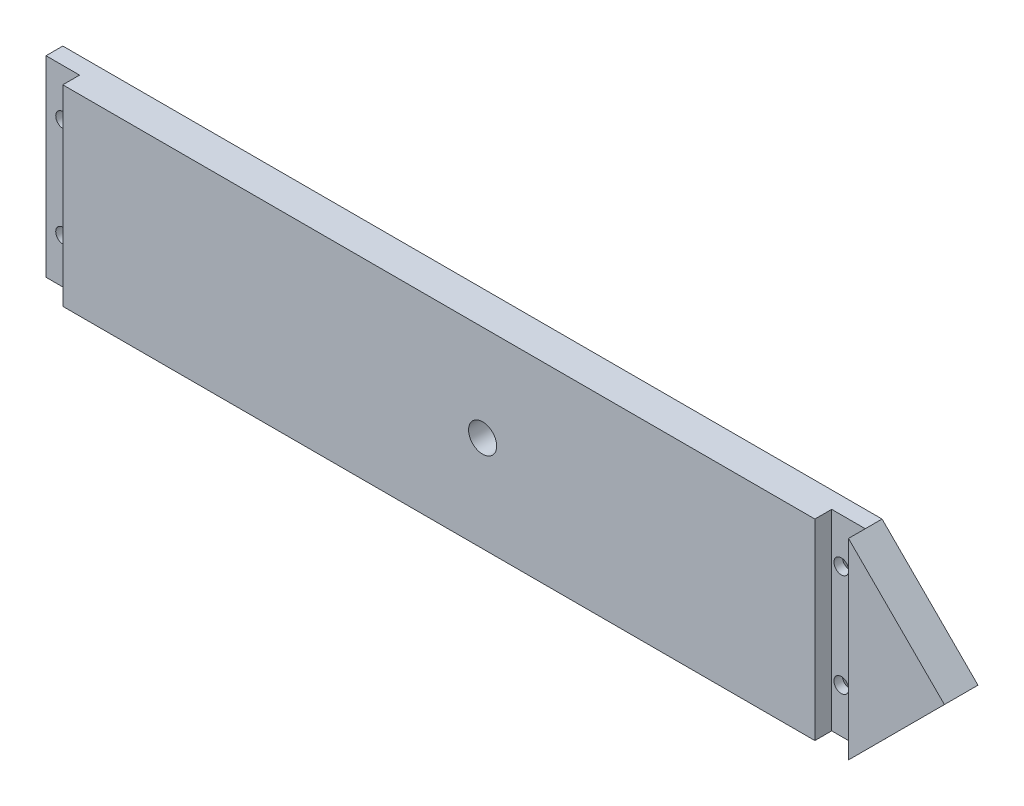
ISO-10303-21;
HEADER;
FILE_DESCRIPTION(('STEP AP214'),'2;1');
FILE_NAME('part.step','',(''),(''),'','','');
FILE_SCHEMA(('AUTOMOTIVE_DESIGN { 1 0 10303 214 1 1 1 1 }'));
ENDSEC;
DATA;
#1=APPLICATION_CONTEXT('core data for automotive mechanical design processes');
#2=APPLICATION_PROTOCOL_DEFINITION('international standard','automotive_design',2000,#1);
#3=PRODUCT_CONTEXT('',#1,'mechanical');
#4=PRODUCT('Part','Part','',(#3));
#5=PRODUCT_RELATED_PRODUCT_CATEGORY('part','',(#4));
#6=PRODUCT_DEFINITION_FORMATION('','',#4);
#7=PRODUCT_DEFINITION_CONTEXT('part definition',#1,'design');
#8=PRODUCT_DEFINITION('design','',#6,#7);
#9=PRODUCT_DEFINITION_SHAPE('','',#8);
#10=(LENGTH_UNIT() NAMED_UNIT(*) SI_UNIT(.MILLI.,.METRE.));
#11=(NAMED_UNIT(*) PLANE_ANGLE_UNIT() SI_UNIT($,.RADIAN.));
#12=(NAMED_UNIT(*) SI_UNIT($,.STERADIAN.) SOLID_ANGLE_UNIT());
#13=UNCERTAINTY_MEASURE_WITH_UNIT(LENGTH_MEASURE(1.E-05),#10,'distance_accuracy_value','');
#14=(GEOMETRIC_REPRESENTATION_CONTEXT(3) GLOBAL_UNCERTAINTY_ASSIGNED_CONTEXT((#13)) GLOBAL_UNIT_ASSIGNED_CONTEXT((#10,
#11,#12)) REPRESENTATION_CONTEXT('',''));
#15=CARTESIAN_POINT('',(0.,0.,0.));
#16=DIRECTION('',(0.,0.,1.));
#17=DIRECTION('',(1.,0.,0.));
#18=AXIS2_PLACEMENT_3D('',#15,#16,#17);
#19=CARTESIAN_POINT('',(86.51875,-18.13941,6.35));
#20=DIRECTION('',(0.,0.,-1.));
#21=DIRECTION('',(-1.,0.,0.));
#22=AXIS2_PLACEMENT_3D('',#19,#20,#21);
#23=PLANE('',#22);
#24=CARTESIAN_POINT('',(-0.793749999999996,0.,6.35));
#25=DIRECTION('',(0.,0.,1.));
#26=DIRECTION('',(1.,0.,0.));
#27=AXIS2_PLACEMENT_3D('',#24,#25,#26);
#28=CIRCLE('',#27,2.65656867622216);
#29=CARTESIAN_POINT('',(1.86281867622217,0.,6.35));
#30=VERTEX_POINT('',#29);
#31=EDGE_CURVE('E385',#30,#30,#28,.T.);
#32=ORIENTED_EDGE('',*,*,#31,.F.);
#33=EDGE_LOOP('',(#32));
#34=FACE_BOUND('',#33,.T.);
#35=DIRECTION('',(1.,0.,0.));
#36=VECTOR('',#35,1.);
#37=CARTESIAN_POINT('',(86.51875,-18.13941,6.35));
#38=LINE('',#37,#36);
#39=CARTESIAN_POINT('',(-80.1687499999997,-18.13941,6.35));
#40=VERTEX_POINT('',#39);
#41=CARTESIAN_POINT('',(62.0306100000001,-18.13941,6.35));
#42=VERTEX_POINT('',#41);
#43=EDGE_CURVE('E139',#40,#42,#38,.T.);
#44=ORIENTED_EDGE('',*,*,#43,.T.);
#45=DIRECTION('',(0.,-1.,0.));
#46=VECTOR('',#45,1.);
#47=CARTESIAN_POINT('',(62.0306100000001,-18.13941,6.35));
#48=LINE('',#47,#46);
#49=CARTESIAN_POINT('',(62.0306100000001,18.13941,6.35));
#50=VERTEX_POINT('',#49);
#51=EDGE_CURVE('E149',#50,#42,#48,.T.);
#52=ORIENTED_EDGE('',*,*,#51,.F.);
#53=DIRECTION('',(-1.,0.,0.));
#54=VECTOR('',#53,1.);
#55=CARTESIAN_POINT('',(86.51875,18.13941,6.35));
#56=LINE('',#55,#54);
#57=CARTESIAN_POINT('',(-80.1687499999999,18.13941,6.35));
#58=VERTEX_POINT('',#57);
#59=EDGE_CURVE('E136',#50,#58,#56,.T.);
#60=ORIENTED_EDGE('',*,*,#59,.T.);
#61=DIRECTION('',(0.,1.,0.));
#62=VECTOR('',#61,1.);
#63=CARTESIAN_POINT('',(-80.1687499999999,18.13941,6.35));
#64=LINE('',#63,#62);
#65=EDGE_CURVE('E197',#40,#58,#64,.T.);
#66=ORIENTED_EDGE('',*,*,#65,.F.);
#67=EDGE_LOOP('',(#44,#52,#60,#66));
#68=FACE_BOUND('',#67,.T.);
#69=ADVANCED_FACE('F31',(#34,#68),#23,.F.);
#70=CARTESIAN_POINT('',(86.51875,18.13941,6.35));
#71=DIRECTION('',(0.,-1.,0.));
#72=DIRECTION('',(1.,0.,0.));
#73=AXIS2_PLACEMENT_3D('',#70,#71,#72);
#74=PLANE('',#73);
#75=DIRECTION('',(-1.,0.,0.));
#76=VECTOR('',#75,1.);
#77=CARTESIAN_POINT('',(62.0306100000001,18.13941,3.175));
#78=LINE('',#77,#76);
#79=CARTESIAN_POINT('',(68.3806100000099,18.1394100000318,3.175));
#80=VERTEX_POINT('',#79);
#81=CARTESIAN_POINT('',(62.0306100000001,18.13941,3.175));
#82=VERTEX_POINT('',#81);
#83=EDGE_CURVE('E188',#80,#82,#78,.T.);
#84=ORIENTED_EDGE('',*,*,#83,.F.);
#85=DIRECTION('',(0.,0.,1.));
#86=VECTOR('',#85,1.);
#87=CARTESIAN_POINT('',(68.3806100000099,18.1394100000318,0.));
#88=LINE('',#87,#86);
#89=CARTESIAN_POINT('',(68.3806100000099,18.1394100000318,0.));
#90=VERTEX_POINT('',#89);
#91=EDGE_CURVE('E120',#90,#80,#88,.T.);
#92=ORIENTED_EDGE('',*,*,#91,.F.);
#93=DIRECTION('',(-1.,0.,0.));
#94=VECTOR('',#93,1.);
#95=CARTESIAN_POINT('',(86.51875,18.13941,0.));
#96=LINE('',#95,#94);
#97=CARTESIAN_POINT('',(-86.51875,18.13941,0.));
#98=VERTEX_POINT('',#97);
#99=EDGE_CURVE('E141',#90,#98,#96,.T.);
#100=ORIENTED_EDGE('',*,*,#99,.T.);
#101=DIRECTION('',(0.,0.,-1.));
#102=VECTOR('',#101,1.);
#103=CARTESIAN_POINT('',(-86.51875,18.13941,6.35));
#104=LINE('',#103,#102);
#105=CARTESIAN_POINT('',(-86.51875,18.13941,3.175));
#106=VERTEX_POINT('',#105);
#107=EDGE_CURVE('E11',#106,#98,#104,.T.);
#108=ORIENTED_EDGE('',*,*,#107,.F.);
#109=DIRECTION('',(-1.,0.,0.));
#110=VECTOR('',#109,1.);
#111=CARTESIAN_POINT('',(-86.51875,18.13941,3.175));
#112=LINE('',#111,#110);
#113=CARTESIAN_POINT('',(-80.1687499999999,18.13941,3.175));
#114=VERTEX_POINT('',#113);
#115=EDGE_CURVE('E211',#114,#106,#112,.T.);
#116=ORIENTED_EDGE('',*,*,#115,.F.);
#117=DIRECTION('',(0.,0.,1.));
#118=VECTOR('',#117,1.);
#119=CARTESIAN_POINT('',(-80.1687499999999,18.13941,3.175));
#120=LINE('',#119,#118);
#121=EDGE_CURVE('E214',#114,#58,#120,.T.);
#122=ORIENTED_EDGE('',*,*,#121,.T.);
#123=ORIENTED_EDGE('',*,*,#59,.F.);
#124=DIRECTION('',(0.,0.,1.));
#125=VECTOR('',#124,1.);
#126=CARTESIAN_POINT('',(62.0306100000001,18.13941,3.175));
#127=LINE('',#126,#125);
#128=EDGE_CURVE('E195',#82,#50,#127,.T.);
#129=ORIENTED_EDGE('',*,*,#128,.F.);
#130=EDGE_LOOP('',(#84,#92,#100,#108,#116,#122,#123,#129));
#131=FACE_BOUND('',#130,.T.);
#132=ADVANCED_FACE('F33',(#131),#74,.F.);
#133=CARTESIAN_POINT('',(-86.51875,18.13941,6.35));
#134=DIRECTION('',(1.,0.,0.));
#135=DIRECTION('',(0.,0.,-1.));
#136=AXIS2_PLACEMENT_3D('',#133,#134,#135);
#137=PLANE('',#136);
#138=DIRECTION('',(0.,0.,-1.));
#139=VECTOR('',#138,1.);
#140=CARTESIAN_POINT('',(-86.51875,-18.13941,6.35));
#141=LINE('',#140,#139);
#142=CARTESIAN_POINT('',(-86.51875,-18.13941,3.175));
#143=VERTEX_POINT('',#142);
#144=CARTESIAN_POINT('',(-86.51875,-18.13941,0.));
#145=VERTEX_POINT('',#144);
#146=EDGE_CURVE('E40',#143,#145,#141,.T.);
#147=ORIENTED_EDGE('',*,*,#146,.F.);
#148=DIRECTION('',(0.,-1.,0.));
#149=VECTOR('',#148,1.);
#150=CARTESIAN_POINT('',(-86.51875,-18.13941,3.175));
#151=LINE('',#150,#149);
#152=EDGE_CURVE('E203',#106,#143,#151,.T.);
#153=ORIENTED_EDGE('',*,*,#152,.F.);
#154=ORIENTED_EDGE('',*,*,#107,.T.);
#155=DIRECTION('',(0.,-1.,0.));
#156=VECTOR('',#155,1.);
#157=CARTESIAN_POINT('',(-86.51875,18.13941,0.));
#158=LINE('',#157,#156);
#159=EDGE_CURVE('E137',#98,#145,#158,.T.);
#160=ORIENTED_EDGE('',*,*,#159,.T.);
#161=EDGE_LOOP('',(#147,#153,#154,#160));
#162=FACE_BOUND('',#161,.T.);
#163=ADVANCED_FACE('F226',(#162),#137,.F.);
#164=CARTESIAN_POINT('',(86.51875,-18.13941,6.35));
#165=DIRECTION('',(0.,1.,0.));
#166=DIRECTION('',(-1.,0.,0.));
#167=AXIS2_PLACEMENT_3D('',#164,#165,#166);
#168=PLANE('',#167);
#169=DIRECTION('',(1.,0.,0.));
#170=VECTOR('',#169,1.);
#171=CARTESIAN_POINT('',(86.51875,-18.13941,0.));
#172=LINE('',#171,#170);
#173=CARTESIAN_POINT('',(68.38061,-18.13941,0.));
#174=VERTEX_POINT('',#173);
#175=EDGE_CURVE('E128',#145,#174,#172,.T.);
#176=ORIENTED_EDGE('',*,*,#175,.T.);
#177=DIRECTION('',(0.,0.,1.));
#178=VECTOR('',#177,1.);
#179=CARTESIAN_POINT('',(68.38061,-18.13941,0.));
#180=LINE('',#179,#178);
#181=CARTESIAN_POINT('',(68.38061,-18.13941,3.175));
#182=VERTEX_POINT('',#181);
#183=EDGE_CURVE('E110',#174,#182,#180,.T.);
#184=ORIENTED_EDGE('',*,*,#183,.T.);
#185=DIRECTION('',(1.,0.,0.));
#186=VECTOR('',#185,1.);
#187=CARTESIAN_POINT('',(68.38061,-18.13941,3.175));
#188=LINE('',#187,#186);
#189=CARTESIAN_POINT('',(62.0306100000001,-18.13941,3.175));
#190=VERTEX_POINT('',#189);
#191=EDGE_CURVE('E181',#190,#182,#188,.T.);
#192=ORIENTED_EDGE('',*,*,#191,.F.);
#193=DIRECTION('',(0.,0.,1.));
#194=VECTOR('',#193,1.);
#195=CARTESIAN_POINT('',(62.0306100000001,-18.13941,3.175));
#196=LINE('',#195,#194);
#197=EDGE_CURVE('E191',#190,#42,#196,.T.);
#198=ORIENTED_EDGE('',*,*,#197,.T.);
#199=ORIENTED_EDGE('',*,*,#43,.F.);
#200=DIRECTION('',(0.,0.,1.));
#201=VECTOR('',#200,1.);
#202=CARTESIAN_POINT('',(-80.1687499999997,-18.13941,3.175));
#203=LINE('',#202,#201);
#204=CARTESIAN_POINT('',(-80.1687499999997,-18.13941,3.175));
#205=VERTEX_POINT('',#204);
#206=EDGE_CURVE('E56',#205,#40,#203,.T.);
#207=ORIENTED_EDGE('',*,*,#206,.F.);
#208=DIRECTION('',(1.,0.,0.));
#209=VECTOR('',#208,1.);
#210=CARTESIAN_POINT('',(-80.1687499999997,-18.13941,3.175));
#211=LINE('',#210,#209);
#212=EDGE_CURVE('E205',#143,#205,#211,.T.);
#213=ORIENTED_EDGE('',*,*,#212,.F.);
#214=ORIENTED_EDGE('',*,*,#146,.T.);
#215=EDGE_LOOP('',(#176,#184,#192,#198,#199,#207,#213,#214));
#216=FACE_BOUND('',#215,.T.);
#217=ADVANCED_FACE('F132',(#216),#168,.F.);
#218=DIRECTION('',(0.,1.,0.));
#219=VECTOR('',#218,1.);
#220=CARTESIAN_POINT('',(68.3806100000001,18.13941,6.35));
#221=LINE('',#220,#219);
#222=CARTESIAN_POINT('',(68.38061,-18.13941,6.35));
#223=VERTEX_POINT('',#222);
#224=CARTESIAN_POINT('',(68.3806100000099,18.1394100000318,6.35));
#225=VERTEX_POINT('',#224);
#226=EDGE_CURVE('E182',#223,#225,#221,.T.);
#227=ORIENTED_EDGE('',*,*,#226,.F.);
#228=DIRECTION('',(-0.707082026446583,-0.707131535059916,0.));
#229=VECTOR('',#228,1.);
#230=CARTESIAN_POINT('',(86.5187500000194,0.,6.35));
#231=LINE('',#230,#229);
#232=CARTESIAN_POINT('',(86.5187500000194,0.,6.35));
#233=VERTEX_POINT('',#232);
#234=EDGE_CURVE('E48',#233,#223,#231,.T.);
#235=ORIENTED_EDGE('',*,*,#234,.F.);
#236=DIRECTION('',(0.70708202644577,-0.707131535060729,0.));
#237=VECTOR('',#236,1.);
#238=CARTESIAN_POINT('',(86.5187500000194,0.,6.35));
#239=LINE('',#238,#237);
#240=EDGE_CURVE('E130',#225,#233,#239,.T.);
#241=ORIENTED_EDGE('',*,*,#240,.F.);
#242=EDGE_LOOP('',(#227,#235,#241));
#243=FACE_BOUND('',#242,.T.);
#244=ADVANCED_FACE('F248',(#243),#23,.F.);
#245=CARTESIAN_POINT('',(86.51875,-18.13941,0.));
#246=DIRECTION('',(0.,0.,-1.));
#247=DIRECTION('',(-1.,0.,0.));
#248=AXIS2_PLACEMENT_3D('',#245,#246,#247);
#249=PLANE('',#248);
#250=CARTESIAN_POINT('',(-0.793749999999996,0.,0.));
#251=DIRECTION('',(0.,0.,1.));
#252=DIRECTION('',(1.,0.,0.));
#253=AXIS2_PLACEMENT_3D('',#250,#251,#252);
#254=CIRCLE('',#253,2.65656867622216);
#255=CARTESIAN_POINT('',(1.86281867622217,0.,0.));
#256=VERTEX_POINT('',#255);
#257=EDGE_CURVE('E250',#256,#256,#254,.T.);
#258=ORIENTED_EDGE('',*,*,#257,.T.);
#259=EDGE_LOOP('',(#258));
#260=FACE_BOUND('',#259,.T.);
#261=DIRECTION('',(-0.707082026446583,-0.707131535059916,0.));
#262=VECTOR('',#261,1.);
#263=CARTESIAN_POINT('',(86.5187500000194,0.,0.));
#264=LINE('',#263,#262);
#265=CARTESIAN_POINT('',(86.5187500000194,0.,0.));
#266=VERTEX_POINT('',#265);
#267=EDGE_CURVE('E113',#266,#174,#264,.T.);
#268=ORIENTED_EDGE('',*,*,#267,.T.);
#269=ORIENTED_EDGE('',*,*,#175,.F.);
#270=ORIENTED_EDGE('',*,*,#159,.F.);
#271=ORIENTED_EDGE('',*,*,#99,.F.);
#272=DIRECTION('',(0.70708202644577,-0.707131535060729,0.));
#273=VECTOR('',#272,1.);
#274=CARTESIAN_POINT('',(86.5187500000194,0.,0.));
#275=LINE('',#274,#273);
#276=EDGE_CURVE('E121',#90,#266,#275,.T.);
#277=ORIENTED_EDGE('',*,*,#276,.T.);
#278=EDGE_LOOP('',(#268,#269,#270,#271,#277));
#279=FACE_BOUND('',#278,.T.);
#280=CARTESIAN_POINT('',(63.8530599999999,-9.71423000000021,0.));
#281=DIRECTION('',(0.,0.,-1.));
#282=DIRECTION('',(-1.,0.,0.));
#283=AXIS2_PLACEMENT_3D('',#280,#281,#282);
#284=CIRCLE('',#283,2.75844);
#285=CARTESIAN_POINT('',(61.0946199999999,-9.71423000000021,0.));
#286=VERTEX_POINT('',#285);
#287=EDGE_CURVE('E256',#286,#286,#284,.T.);
#288=ORIENTED_EDGE('',*,*,#287,.F.);
#289=EDGE_LOOP('',(#288));
#290=FACE_BOUND('',#289,.T.);
#291=CARTESIAN_POINT('',(63.8530599999999,9.71422999999981,0.));
#292=DIRECTION('',(0.,0.,-1.));
#293=DIRECTION('',(-1.,0.,0.));
#294=AXIS2_PLACEMENT_3D('',#291,#292,#293);
#295=CIRCLE('',#294,2.75844);
#296=CARTESIAN_POINT('',(61.0946199999999,9.71422999999981,0.));
#297=VERTEX_POINT('',#296);
#298=EDGE_CURVE('E164',#297,#297,#295,.T.);
#299=ORIENTED_EDGE('',*,*,#298,.F.);
#300=EDGE_LOOP('',(#299));
#301=FACE_BOUND('',#300,.T.);
#302=CARTESIAN_POINT('',(-83.28152,9.21254788689416,0.));
#303=DIRECTION('',(0.,0.,-1.));
#304=DIRECTION('',(-1.,0.,0.));
#305=AXIS2_PLACEMENT_3D('',#302,#303,#304);
#306=CIRCLE('',#305,2.75844);
#307=CARTESIAN_POINT('',(-86.03996,9.21254788689416,0.));
#308=VERTEX_POINT('',#307);
#309=EDGE_CURVE('E157',#308,#308,#306,.T.);
#310=ORIENTED_EDGE('',*,*,#309,.F.);
#311=EDGE_LOOP('',(#310));
#312=FACE_BOUND('',#311,.T.);
#313=CARTESIAN_POINT('',(-83.28152,-9.72699783557712,0.));
#314=DIRECTION('',(0.,0.,-1.));
#315=DIRECTION('',(-1.,0.,0.));
#316=AXIS2_PLACEMENT_3D('',#313,#314,#315);
#317=CIRCLE('',#316,2.75844);
#318=CARTESIAN_POINT('',(-86.03996,-9.72699783557712,0.));
#319=VERTEX_POINT('',#318);
#320=EDGE_CURVE('E153',#319,#319,#317,.T.);
#321=ORIENTED_EDGE('',*,*,#320,.F.);
#322=EDGE_LOOP('',(#321));
#323=FACE_BOUND('',#322,.T.);
#324=ADVANCED_FACE('F125',(#260,#279,#290,#301,#312,#323),#249,.T.);
#325=CARTESIAN_POINT('',(-80.1687499999999,18.13941,3.175));
#326=DIRECTION('',(1.,0.,0.));
#327=DIRECTION('',(0.,1.,0.));
#328=AXIS2_PLACEMENT_3D('',#325,#326,#327);
#329=PLANE('',#328);
#330=ORIENTED_EDGE('',*,*,#65,.T.);
#331=ORIENTED_EDGE('',*,*,#121,.F.);
#332=DIRECTION('',(0.,1.,0.));
#333=VECTOR('',#332,1.);
#334=CARTESIAN_POINT('',(-80.1687499999999,18.13941,3.175));
#335=LINE('',#334,#333);
#336=EDGE_CURVE('E208',#205,#114,#335,.T.);
#337=ORIENTED_EDGE('',*,*,#336,.F.);
#338=ORIENTED_EDGE('',*,*,#206,.T.);
#339=EDGE_LOOP('',(#330,#331,#337,#338));
#340=FACE_BOUND('',#339,.T.);
#341=ADVANCED_FACE('F233',(#340),#329,.F.);
#342=CARTESIAN_POINT('',(-86.51875,18.13941,3.175));
#343=DIRECTION('',(0.,0.,-1.));
#344=DIRECTION('',(-1.,0.,0.));
#345=AXIS2_PLACEMENT_3D('',#342,#343,#344);
#346=PLANE('',#345);
#347=CARTESIAN_POINT('',(-83.28152,9.21254788689416,3.175));
#348=DIRECTION('',(0.,0.,-1.));
#349=DIRECTION('',(-1.,0.,0.));
#350=AXIS2_PLACEMENT_3D('',#347,#348,#349);
#351=CIRCLE('',#350,1.39699999999999);
#352=CARTESIAN_POINT('',(-84.6785199999999,9.21254788689416,3.175));
#353=VERTEX_POINT('',#352);
#354=EDGE_CURVE('E151',#353,#353,#351,.T.);
#355=ORIENTED_EDGE('',*,*,#354,.T.);
#356=EDGE_LOOP('',(#355));
#357=FACE_BOUND('',#356,.T.);
#358=CARTESIAN_POINT('',(-83.28152,-9.72699783557712,3.175));
#359=DIRECTION('',(0.,0.,-1.));
#360=DIRECTION('',(-1.,0.,0.));
#361=AXIS2_PLACEMENT_3D('',#358,#359,#360);
#362=CIRCLE('',#361,1.397);
#363=CARTESIAN_POINT('',(-84.67852,-9.72699783557712,3.175));
#364=VERTEX_POINT('',#363);
#365=EDGE_CURVE('E146',#364,#364,#362,.T.);
#366=ORIENTED_EDGE('',*,*,#365,.T.);
#367=EDGE_LOOP('',(#366));
#368=FACE_BOUND('',#367,.T.);
#369=ORIENTED_EDGE('',*,*,#152,.T.);
#370=ORIENTED_EDGE('',*,*,#212,.T.);
#371=ORIENTED_EDGE('',*,*,#336,.T.);
#372=ORIENTED_EDGE('',*,*,#115,.T.);
#373=EDGE_LOOP('',(#369,#370,#371,#372));
#374=FACE_BOUND('',#373,.T.);
#375=ADVANCED_FACE('F228',(#357,#368,#374),#346,.F.);
#376=CARTESIAN_POINT('',(62.0306100000001,-18.13941,3.175));
#377=DIRECTION('',(-1.,0.,0.));
#378=DIRECTION('',(0.,-1.,0.));
#379=AXIS2_PLACEMENT_3D('',#376,#377,#378);
#380=PLANE('',#379);
#381=ORIENTED_EDGE('',*,*,#51,.T.);
#382=ORIENTED_EDGE('',*,*,#197,.F.);
#383=DIRECTION('',(0.,-1.,0.));
#384=VECTOR('',#383,1.);
#385=CARTESIAN_POINT('',(62.0306100000001,-18.13941,3.175));
#386=LINE('',#385,#384);
#387=EDGE_CURVE('E178',#82,#190,#386,.T.);
#388=ORIENTED_EDGE('',*,*,#387,.F.);
#389=ORIENTED_EDGE('',*,*,#128,.T.);
#390=EDGE_LOOP('',(#381,#382,#388,#389));
#391=FACE_BOUND('',#390,.T.);
#392=ADVANCED_FACE('F236',(#391),#380,.F.);
#393=CARTESIAN_POINT('',(68.3806100000001,18.13941,3.175));
#394=DIRECTION('',(1.,0.,0.));
#395=DIRECTION('',(0.,1.,0.));
#396=AXIS2_PLACEMENT_3D('',#393,#394,#395);
#397=PLANE('',#396);
#398=ORIENTED_EDGE('',*,*,#226,.T.);
#399=DIRECTION('',(0.,0.,1.));
#400=VECTOR('',#399,1.);
#401=CARTESIAN_POINT('',(68.3806100000001,18.13941,3.175));
#402=LINE('',#401,#400);
#403=EDGE_CURVE('E198',#80,#225,#402,.T.);
#404=ORIENTED_EDGE('',*,*,#403,.F.);
#405=DIRECTION('',(0.,1.,0.));
#406=VECTOR('',#405,1.);
#407=CARTESIAN_POINT('',(68.3806100000001,18.13941,3.175));
#408=LINE('',#407,#406);
#409=EDGE_CURVE('E185',#182,#80,#408,.T.);
#410=ORIENTED_EDGE('',*,*,#409,.F.);
#411=DIRECTION('',(0.,0.,1.));
#412=VECTOR('',#411,1.);
#413=CARTESIAN_POINT('',(68.38061,-18.13941,3.175));
#414=LINE('',#413,#412);
#415=EDGE_CURVE('E115',#182,#223,#414,.T.);
#416=ORIENTED_EDGE('',*,*,#415,.T.);
#417=EDGE_LOOP('',(#398,#404,#410,#416));
#418=FACE_BOUND('',#417,.T.);
#419=ADVANCED_FACE('F241',(#418),#397,.F.);
#420=CARTESIAN_POINT('',(62.0306100000001,18.13941,3.175));
#421=DIRECTION('',(0.,0.,-1.));
#422=DIRECTION('',(-1.,0.,0.));
#423=AXIS2_PLACEMENT_3D('',#420,#421,#422);
#424=PLANE('',#423);
#425=CARTESIAN_POINT('',(63.8530599999999,-9.71423000000021,3.175));
#426=DIRECTION('',(0.,0.,-1.));
#427=DIRECTION('',(-1.,0.,0.));
#428=AXIS2_PLACEMENT_3D('',#425,#426,#427);
#429=CIRCLE('',#428,1.39699999999998);
#430=CARTESIAN_POINT('',(62.45606,-9.71423000000021,3.175));
#431=VERTEX_POINT('',#430);
#432=EDGE_CURVE('E35',#431,#431,#429,.T.);
#433=ORIENTED_EDGE('',*,*,#432,.T.);
#434=EDGE_LOOP('',(#433));
#435=FACE_BOUND('',#434,.T.);
#436=CARTESIAN_POINT('',(63.8530599999999,9.71422999999981,3.175));
#437=DIRECTION('',(0.,0.,-1.));
#438=DIRECTION('',(-1.,0.,0.));
#439=AXIS2_PLACEMENT_3D('',#436,#437,#438);
#440=CIRCLE('',#439,1.39699999999998);
#441=CARTESIAN_POINT('',(62.45606,9.71422999999981,3.175));
#442=VERTEX_POINT('',#441);
#443=EDGE_CURVE('E155',#442,#442,#440,.T.);
#444=ORIENTED_EDGE('',*,*,#443,.T.);
#445=EDGE_LOOP('',(#444));
#446=FACE_BOUND('',#445,.T.);
#447=ORIENTED_EDGE('',*,*,#387,.T.);
#448=ORIENTED_EDGE('',*,*,#191,.T.);
#449=ORIENTED_EDGE('',*,*,#409,.T.);
#450=ORIENTED_EDGE('',*,*,#83,.T.);
#451=EDGE_LOOP('',(#447,#448,#449,#450));
#452=FACE_BOUND('',#451,.T.);
#453=ADVANCED_FACE('F238',(#435,#446,#452),#424,.F.);
#454=CARTESIAN_POINT('',(-83.28152,-9.72699783557712,0.));
#455=DIRECTION('',(0.,0.,-1.));
#456=DIRECTION('',(-1.,0.,0.));
#457=AXIS2_PLACEMENT_3D('',#454,#455,#456);
#458=CYLINDRICAL_SURFACE('',#457,1.397);
#459=CARTESIAN_POINT('',(-83.28152,-9.72699783557712,1.56615756432699));
#460=DIRECTION('',(0.,0.,-1.));
#461=DIRECTION('',(-1.,0.,0.));
#462=AXIS2_PLACEMENT_3D('',#459,#460,#461);
#463=CIRCLE('',#462,1.397);
#464=CARTESIAN_POINT('',(-84.67852,-9.72699783557712,1.56615756432699));
#465=VERTEX_POINT('',#464);
#466=EDGE_CURVE('E150',#465,#465,#463,.T.);
#467=ORIENTED_EDGE('',*,*,#466,.T.);
#468=EDGE_LOOP('',(#467));
#469=FACE_BOUND('',#468,.T.);
#470=ORIENTED_EDGE('',*,*,#365,.F.);
#471=EDGE_LOOP('',(#470));
#472=FACE_BOUND('',#471,.T.);
#473=ADVANCED_FACE('F338',(#469,#472),#458,.F.);
#474=CARTESIAN_POINT('',(-83.28152,-9.72699783557712,0.));
#475=DIRECTION('',(0.,0.,-1.));
#476=DIRECTION('',(-1.,0.,0.));
#477=AXIS2_PLACEMENT_3D('',#474,#475,#476);
#478=CONICAL_SURFACE('',#477,2.75844,0.715584993317676);
#479=ORIENTED_EDGE('',*,*,#466,.F.);
#480=EDGE_LOOP('',(#479));
#481=FACE_BOUND('',#480,.T.);
#482=ORIENTED_EDGE('',*,*,#320,.T.);
#483=EDGE_LOOP('',(#482));
#484=FACE_BOUND('',#483,.T.);
#485=ADVANCED_FACE('F407',(#481,#484),#478,.F.);
#486=CARTESIAN_POINT('',(-83.28152,9.21254788689416,0.));
#487=DIRECTION('',(0.,0.,-1.));
#488=DIRECTION('',(-1.,0.,0.));
#489=AXIS2_PLACEMENT_3D('',#486,#487,#488);
#490=CYLINDRICAL_SURFACE('',#489,1.39699999999999);
#491=CARTESIAN_POINT('',(-83.28152,9.21254788689416,1.56615756432701));
#492=DIRECTION('',(0.,0.,-1.));
#493=DIRECTION('',(-1.,0.,0.));
#494=AXIS2_PLACEMENT_3D('',#491,#492,#493);
#495=CIRCLE('',#494,1.39699999999998);
#496=CARTESIAN_POINT('',(-84.6785199999999,9.21254788689416,1.56615756432701));
#497=VERTEX_POINT('',#496);
#498=EDGE_CURVE('E154',#497,#497,#495,.T.);
#499=ORIENTED_EDGE('',*,*,#498,.T.);
#500=EDGE_LOOP('',(#499));
#501=FACE_BOUND('',#500,.T.);
#502=ORIENTED_EDGE('',*,*,#354,.F.);
#503=EDGE_LOOP('',(#502));
#504=FACE_BOUND('',#503,.T.);
#505=ADVANCED_FACE('F416',(#501,#504),#490,.F.);
#506=CARTESIAN_POINT('',(-83.28152,9.21254788689416,0.));
#507=DIRECTION('',(0.,0.,-1.));
#508=DIRECTION('',(-1.,0.,0.));
#509=AXIS2_PLACEMENT_3D('',#506,#507,#508);
#510=CONICAL_SURFACE('',#509,2.75844,0.715584993317677);
#511=ORIENTED_EDGE('',*,*,#498,.F.);
#512=EDGE_LOOP('',(#511));
#513=FACE_BOUND('',#512,.T.);
#514=ORIENTED_EDGE('',*,*,#309,.T.);
#515=EDGE_LOOP('',(#514));
#516=FACE_BOUND('',#515,.T.);
#517=ADVANCED_FACE('F426',(#513,#516),#510,.F.);
#518=CARTESIAN_POINT('',(63.8530599999999,9.71422999999981,0.));
#519=DIRECTION('',(0.,0.,-1.));
#520=DIRECTION('',(-1.,0.,0.));
#521=AXIS2_PLACEMENT_3D('',#518,#519,#520);
#522=CYLINDRICAL_SURFACE('',#521,1.39699999999998);
#523=CARTESIAN_POINT('',(63.8530599999999,9.71422999999981,1.56615756432701));
#524=DIRECTION('',(0.,0.,-1.));
#525=DIRECTION('',(-1.,0.,0.));
#526=AXIS2_PLACEMENT_3D('',#523,#524,#525);
#527=CIRCLE('',#526,1.39699999999998);
#528=CARTESIAN_POINT('',(62.45606,9.71422999999981,1.56615756432701));
#529=VERTEX_POINT('',#528);
#530=EDGE_CURVE('E158',#529,#529,#527,.T.);
#531=ORIENTED_EDGE('',*,*,#530,.T.);
#532=EDGE_LOOP('',(#531));
#533=FACE_BOUND('',#532,.T.);
#534=ORIENTED_EDGE('',*,*,#443,.F.);
#535=EDGE_LOOP('',(#534));
#536=FACE_BOUND('',#535,.T.);
#537=ADVANCED_FACE('F278',(#533,#536),#522,.F.);
#538=CARTESIAN_POINT('',(63.8530599999999,9.71422999999981,0.));
#539=DIRECTION('',(0.,0.,-1.));
#540=DIRECTION('',(-1.,0.,0.));
#541=AXIS2_PLACEMENT_3D('',#538,#539,#540);
#542=CONICAL_SURFACE('',#541,2.75844,0.715584993317677);
#543=ORIENTED_EDGE('',*,*,#530,.F.);
#544=EDGE_LOOP('',(#543));
#545=FACE_BOUND('',#544,.T.);
#546=ORIENTED_EDGE('',*,*,#298,.T.);
#547=EDGE_LOOP('',(#546));
#548=FACE_BOUND('',#547,.T.);
#549=ADVANCED_FACE('F270',(#545,#548),#542,.F.);
#550=CARTESIAN_POINT('',(63.8530599999999,-9.71423000000021,0.));
#551=DIRECTION('',(0.,0.,-1.));
#552=DIRECTION('',(-1.,0.,0.));
#553=AXIS2_PLACEMENT_3D('',#550,#551,#552);
#554=CYLINDRICAL_SURFACE('',#553,1.39699999999998);
#555=CARTESIAN_POINT('',(63.8530599999999,-9.71423000000021,1.56615756432701));
#556=DIRECTION('',(0.,0.,-1.));
#557=DIRECTION('',(-1.,0.,0.));
#558=AXIS2_PLACEMENT_3D('',#555,#556,#557);
#559=CIRCLE('',#558,1.39699999999998);
#560=CARTESIAN_POINT('',(62.45606,-9.71423000000021,1.56615756432701));
#561=VERTEX_POINT('',#560);
#562=EDGE_CURVE('E259',#561,#561,#559,.T.);
#563=ORIENTED_EDGE('',*,*,#562,.T.);
#564=EDGE_LOOP('',(#563));
#565=FACE_BOUND('',#564,.T.);
#566=ORIENTED_EDGE('',*,*,#432,.F.);
#567=EDGE_LOOP('',(#566));
#568=FACE_BOUND('',#567,.T.);
#569=ADVANCED_FACE('F267',(#565,#568),#554,.F.);
#570=CARTESIAN_POINT('',(63.8530599999999,-9.71423000000021,0.));
#571=DIRECTION('',(0.,0.,-1.));
#572=DIRECTION('',(-1.,0.,0.));
#573=AXIS2_PLACEMENT_3D('',#570,#571,#572);
#574=CONICAL_SURFACE('',#573,2.75844,0.715584993317677);
#575=ORIENTED_EDGE('',*,*,#562,.F.);
#576=EDGE_LOOP('',(#575));
#577=FACE_BOUND('',#576,.T.);
#578=ORIENTED_EDGE('',*,*,#287,.T.);
#579=EDGE_LOOP('',(#578));
#580=FACE_BOUND('',#579,.T.);
#581=ADVANCED_FACE('F269',(#577,#580),#574,.F.);
#582=CARTESIAN_POINT('',(86.5187500000194,0.,0.));
#583=DIRECTION('',(-0.707131535059916,0.707082026446583,0.));
#584=DIRECTION('',(-0.707082026446583,-0.707131535059916,0.));
#585=AXIS2_PLACEMENT_3D('',#582,#583,#584);
#586=PLANE('',#585);
#587=ORIENTED_EDGE('',*,*,#234,.T.);
#588=ORIENTED_EDGE('',*,*,#415,.F.);
#589=ORIENTED_EDGE('',*,*,#183,.F.);
#590=ORIENTED_EDGE('',*,*,#267,.F.);
#591=DIRECTION('',(0.,0.,1.));
#592=VECTOR('',#591,1.);
#593=CARTESIAN_POINT('',(86.5187500000194,0.,0.));
#594=LINE('',#593,#592);
#595=EDGE_CURVE('E254',#266,#233,#594,.T.);
#596=ORIENTED_EDGE('',*,*,#595,.T.);
#597=EDGE_LOOP('',(#587,#588,#589,#590,#596));
#598=FACE_BOUND('',#597,.T.);
#599=ADVANCED_FACE('F112',(#598),#586,.F.);
#600=CARTESIAN_POINT('',(86.5187500000194,0.,0.));
#601=DIRECTION('',(-0.707131535060729,-0.70708202644577,0.));
#602=DIRECTION('',(0.70708202644577,-0.707131535060729,0.));
#603=AXIS2_PLACEMENT_3D('',#600,#601,#602);
#604=PLANE('',#603);
#605=ORIENTED_EDGE('',*,*,#240,.T.);
#606=ORIENTED_EDGE('',*,*,#595,.F.);
#607=ORIENTED_EDGE('',*,*,#276,.F.);
#608=ORIENTED_EDGE('',*,*,#91,.T.);
#609=ORIENTED_EDGE('',*,*,#403,.T.);
#610=EDGE_LOOP('',(#605,#606,#607,#608,#609));
#611=FACE_BOUND('',#610,.T.);
#612=ADVANCED_FACE('F246',(#611),#604,.F.);
#613=CARTESIAN_POINT('',(-0.793749999999996,0.,0.));
#614=DIRECTION('',(0.,0.,1.));
#615=DIRECTION('',(1.,0.,0.));
#616=AXIS2_PLACEMENT_3D('',#613,#614,#615);
#617=CYLINDRICAL_SURFACE('',#616,2.65656867622216);
#618=ORIENTED_EDGE('',*,*,#257,.F.);
#619=EDGE_LOOP('',(#618));
#620=FACE_BOUND('',#619,.T.);
#621=ORIENTED_EDGE('',*,*,#31,.T.);
#622=EDGE_LOOP('',(#621));
#623=FACE_BOUND('',#622,.T.);
#624=ADVANCED_FACE('F356',(#620,#623),#617,.F.);
#625=CLOSED_SHELL('',(#69,#132,#163,#217,#244,#324,#341,#375,#392,#419,#453,#473,#485,#505,#517,
#537,#549,#569,#581,#599,#612,#624));
#626=MANIFOLD_SOLID_BREP('B2',#625);
#627=ADVANCED_BREP_SHAPE_REPRESENTATION('',(#18,#626),#14);
#628=SHAPE_DEFINITION_REPRESENTATION(#9,#627);
ENDSEC;
END-ISO-10303-21;
